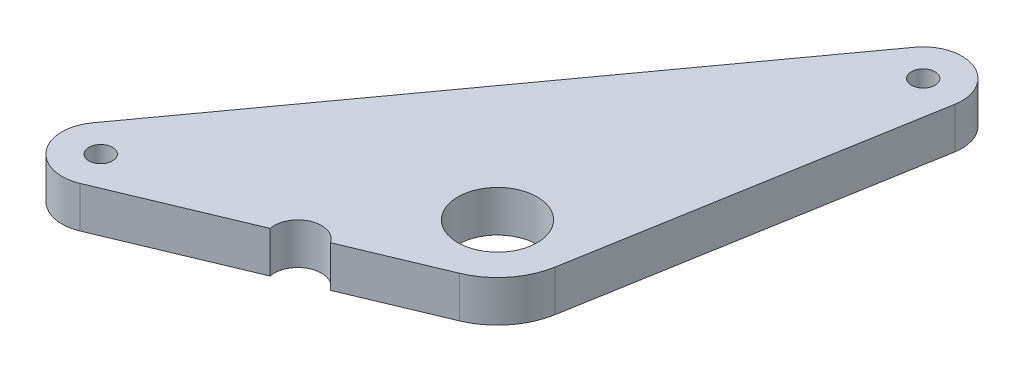
ISO-10303-21;
HEADER;
FILE_DESCRIPTION(('STEP AP214'),'2;1');
FILE_NAME('part.step','',(''),(''),'','','');
FILE_SCHEMA(('AUTOMOTIVE_DESIGN { 1 0 10303 214 1 1 1 1 }'));
ENDSEC;
DATA;
#1=APPLICATION_CONTEXT('core data for automotive mechanical design processes');
#2=APPLICATION_PROTOCOL_DEFINITION('international standard','automotive_design',2000,#1);
#3=PRODUCT_CONTEXT('',#1,'mechanical');
#4=PRODUCT('Part','Part','',(#3));
#5=PRODUCT_RELATED_PRODUCT_CATEGORY('part','',(#4));
#6=PRODUCT_DEFINITION_FORMATION('','',#4);
#7=PRODUCT_DEFINITION_CONTEXT('part definition',#1,'design');
#8=PRODUCT_DEFINITION('design','',#6,#7);
#9=PRODUCT_DEFINITION_SHAPE('','',#8);
#10=(LENGTH_UNIT() NAMED_UNIT(*) SI_UNIT(.MILLI.,.METRE.));
#11=(NAMED_UNIT(*) PLANE_ANGLE_UNIT() SI_UNIT($,.RADIAN.));
#12=(NAMED_UNIT(*) SI_UNIT($,.STERADIAN.) SOLID_ANGLE_UNIT());
#13=UNCERTAINTY_MEASURE_WITH_UNIT(LENGTH_MEASURE(1.E-05),#10,'distance_accuracy_value','');
#14=(GEOMETRIC_REPRESENTATION_CONTEXT(3) GLOBAL_UNCERTAINTY_ASSIGNED_CONTEXT((#13)) GLOBAL_UNIT_ASSIGNED_CONTEXT((#10,
#11,#12)) REPRESENTATION_CONTEXT('',''));
#15=CARTESIAN_POINT('',(0.,0.,0.));
#16=DIRECTION('',(0.,0.,1.));
#17=DIRECTION('',(1.,0.,0.));
#18=AXIS2_PLACEMENT_3D('',#15,#16,#17);
#19=CARTESIAN_POINT('',(368.738835568082,95.885,-12.208730934265));
#20=DIRECTION('',(0.,1.,0.));
#21=DIRECTION('',(0.,0.,1.));
#22=AXIS2_PLACEMENT_3D('',#19,#20,#21);
#23=CYLINDRICAL_SURFACE('',#22,15.24);
#24=CARTESIAN_POINT('',(368.738835568082,104.775,-12.208730934265));
#25=DIRECTION('',(0.,-1.,0.));
#26=DIRECTION('',(0.,0.,-1.));
#27=AXIS2_PLACEMENT_3D('',#24,#25,#26);
#28=CIRCLE('',#27,15.24);
#29=CARTESIAN_POINT('',(383.756046671197,104.775,-9.61239299699919));
#30=VERTEX_POINT('',#29);
#31=CARTESIAN_POINT('',(374.620066838368,104.775,1.85073985041984));
#32=VERTEX_POINT('',#31);
#33=EDGE_CURVE('E71',#30,#32,#28,.T.);
#34=ORIENTED_EDGE('',*,*,#33,.T.);
#35=DIRECTION('',(0.,1.,0.));
#36=VECTOR('',#35,1.);
#37=CARTESIAN_POINT('',(374.620066838368,95.885,1.85073985041984));
#38=LINE('',#37,#36);
#39=CARTESIAN_POINT('',(374.620066838368,95.885,1.85073985041984));
#40=VERTEX_POINT('',#39);
#41=EDGE_CURVE('E117',#40,#32,#38,.T.);
#42=ORIENTED_EDGE('',*,*,#41,.F.);
#43=CARTESIAN_POINT('',(368.738835568082,95.885,-12.208730934265));
#44=DIRECTION('',(0.,-1.,0.));
#45=DIRECTION('',(0.,0.,-1.));
#46=AXIS2_PLACEMENT_3D('',#43,#44,#45);
#47=CIRCLE('',#46,15.24);
#48=CARTESIAN_POINT('',(383.756046671197,95.885,-9.61239299699919));
#49=VERTEX_POINT('',#48);
#50=EDGE_CURVE('E105',#49,#40,#47,.T.);
#51=ORIENTED_EDGE('',*,*,#50,.F.);
#52=DIRECTION('',(0.,1.,0.));
#53=VECTOR('',#52,1.);
#54=CARTESIAN_POINT('',(383.756046671197,95.885,-9.61239299699919));
#55=LINE('',#54,#53);
#56=EDGE_CURVE('E112',#49,#30,#55,.T.);
#57=ORIENTED_EDGE('',*,*,#56,.T.);
#58=EDGE_LOOP('',(#34,#42,#51,#57));
#59=FACE_BOUND('',#58,.T.);
#60=ADVANCED_FACE('F34',(#59),#23,.T.);
#61=CARTESIAN_POINT('',(374.620066838368,95.885,1.85073985041984));
#62=DIRECTION('',(-0.385907563667081,0.,-0.92253745306331));
#63=DIRECTION('',(-0.92253745306331,0.,0.385907563667081));
#64=AXIS2_PLACEMENT_3D('',#61,#62,#63);
#65=PLANE('',#64);
#66=DIRECTION('',(-0.922537453063309,0.,0.385907563667081));
#67=VECTOR('',#66,1.);
#68=CARTESIAN_POINT('',(374.620066838368,104.775,1.85073985041984));
#69=LINE('',#68,#67);
#70=CARTESIAN_POINT('',(355.042542417685,104.775,10.0402336500827));
#71=VERTEX_POINT('',#70);
#72=EDGE_CURVE('E138',#32,#71,#69,.T.);
#73=ORIENTED_EDGE('',*,*,#72,.T.);
#74=DIRECTION('',(0.,1.,0.));
#75=VECTOR('',#74,1.);
#76=CARTESIAN_POINT('',(355.042542417685,95.885,10.0402336500827));
#77=LINE('',#76,#75);
#78=CARTESIAN_POINT('',(355.042542417685,95.885,10.0402336500827));
#79=VERTEX_POINT('',#78);
#80=EDGE_CURVE('E120',#79,#71,#77,.T.);
#81=ORIENTED_EDGE('',*,*,#80,.F.);
#82=DIRECTION('',(-0.922537453063309,0.,0.385907563667081));
#83=VECTOR('',#82,1.);
#84=CARTESIAN_POINT('',(374.620066838368,95.885,1.85073985041984));
#85=LINE('',#84,#83);
#86=EDGE_CURVE('E53',#40,#79,#85,.T.);
#87=ORIENTED_EDGE('',*,*,#86,.F.);
#88=ORIENTED_EDGE('',*,*,#41,.T.);
#89=EDGE_LOOP('',(#73,#81,#87,#88));
#90=FACE_BOUND('',#89,.T.);
#91=ADVANCED_FACE('F160',(#90),#65,.F.);
#92=CARTESIAN_POINT('',(388.21999989401,107.95,-84.4067479512078));
#93=DIRECTION('',(0.,-1.,0.));
#94=DIRECTION('',(0.,0.,-1.));
#95=AXIS2_PLACEMENT_3D('',#92,#93,#94);
#96=CYLINDRICAL_SURFACE('',#95,2.54000000000001);
#97=CARTESIAN_POINT('',(388.21999989401,104.775,-84.4067479512078));
#98=DIRECTION('',(0.,-1.,0.));
#99=DIRECTION('',(0.,0.,-1.));
#100=AXIS2_PLACEMENT_3D('',#97,#98,#99);
#101=CIRCLE('',#100,2.54000000000001);
#102=CARTESIAN_POINT('',(388.21999989401,104.775,-86.9467479512079));
#103=VERTEX_POINT('',#102);
#104=EDGE_CURVE('E194',#103,#103,#101,.F.);
#105=ORIENTED_EDGE('',*,*,#104,.T.);
#106=EDGE_LOOP('',(#105));
#107=FACE_BOUND('',#106,.T.);
#108=CARTESIAN_POINT('',(388.21999989401,95.885,-84.4067479512078));
#109=DIRECTION('',(0.,-1.,0.));
#110=DIRECTION('',(0.,0.,-1.));
#111=AXIS2_PLACEMENT_3D('',#108,#109,#110);
#112=CIRCLE('',#111,2.54000000000001);
#113=CARTESIAN_POINT('',(388.21999989401,95.885,-86.9467479512079));
#114=VERTEX_POINT('',#113);
#115=EDGE_CURVE('E188',#114,#114,#112,.T.);
#116=ORIENTED_EDGE('',*,*,#115,.T.);
#117=EDGE_LOOP('',(#116));
#118=FACE_BOUND('',#117,.T.);
#119=ADVANCED_FACE('F36',(#107,#118),#96,.F.);
#120=CARTESIAN_POINT('',(313.759503148979,107.95,18.2652806586817));
#121=DIRECTION('',(0.,-1.,0.));
#122=DIRECTION('',(0.,0.,-1.));
#123=AXIS2_PLACEMENT_3D('',#120,#121,#122);
#124=CYLINDRICAL_SURFACE('',#123,2.54000000000001);
#125=CARTESIAN_POINT('',(313.759503148979,104.775,18.2652806586817));
#126=DIRECTION('',(0.,-1.,0.));
#127=DIRECTION('',(0.,0.,-1.));
#128=AXIS2_PLACEMENT_3D('',#125,#126,#127);
#129=CIRCLE('',#128,2.54000000000001);
#130=CARTESIAN_POINT('',(313.759503148979,104.775,15.7252806586817));
#131=VERTEX_POINT('',#130);
#132=EDGE_CURVE('E191',#131,#131,#129,.F.);
#133=ORIENTED_EDGE('',*,*,#132,.T.);
#134=EDGE_LOOP('',(#133));
#135=FACE_BOUND('',#134,.T.);
#136=CARTESIAN_POINT('',(313.759503148979,95.885,18.2652806586817));
#137=DIRECTION('',(0.,-1.,0.));
#138=DIRECTION('',(0.,0.,-1.));
#139=AXIS2_PLACEMENT_3D('',#136,#137,#138);
#140=CIRCLE('',#139,2.54000000000001);
#141=CARTESIAN_POINT('',(313.759503148979,95.885,15.7252806586817));
#142=VERTEX_POINT('',#141);
#143=EDGE_CURVE('E135',#142,#142,#140,.T.);
#144=ORIENTED_EDGE('',*,*,#143,.T.);
#145=EDGE_LOOP('',(#144));
#146=FACE_BOUND('',#145,.T.);
#147=ADVANCED_FACE('F212',(#135,#146),#124,.F.);
#148=CARTESIAN_POINT('',(350.8375,95.885,12.8905));
#149=DIRECTION('',(0.,-1.,0.));
#150=DIRECTION('',(0.,0.,-1.));
#151=AXIS2_PLACEMENT_3D('',#148,#149,#150);
#152=PLANE('',#151);
#153=ORIENTED_EDGE('',*,*,#143,.F.);
#154=EDGE_LOOP('',(#153));
#155=FACE_BOUND('',#154,.T.);
#156=CARTESIAN_POINT('',(350.8375,95.885,12.8905));
#157=DIRECTION('',(0.,1.,0.));
#158=DIRECTION('',(0.,0.,-1.));
#159=AXIS2_PLACEMENT_3D('',#156,#157,#158);
#160=CIRCLE('',#159,5.07999999999995);
#161=CARTESIAN_POINT('',(345.855456023667,95.885,13.8832929380733));
#162=VERTEX_POINT('',#161);
#163=EDGE_CURVE('E140',#79,#162,#160,.T.);
#164=ORIENTED_EDGE('',*,*,#163,.T.);
#165=DIRECTION('',(-0.922537453063309,0.,0.385907563667081));
#166=VECTOR('',#165,1.);
#167=CARTESIAN_POINT('',(345.855456023667,95.885,13.8832929380733));
#168=LINE('',#167,#166);
#169=CARTESIAN_POINT('',(316.979331854211,95.885,25.9624932885639));
#170=VERTEX_POINT('',#169);
#171=EDGE_CURVE('E85',#162,#170,#168,.T.);
#172=ORIENTED_EDGE('',*,*,#171,.T.);
#173=CARTESIAN_POINT('',(313.759503148979,95.885,18.2652806586817));
#174=DIRECTION('',(0.,-1.,0.));
#175=DIRECTION('',(0.,0.,-1.));
#176=AXIS2_PLACEMENT_3D('',#173,#174,#175);
#177=CIRCLE('',#176,8.34352318631989);
#178=CARTESIAN_POINT('',(307.005227371757,95.885,13.3668995091696));
#179=VERTEX_POINT('',#178);
#180=EDGE_CURVE('E180',#170,#179,#177,.T.);
#181=ORIENTED_EDGE('',*,*,#180,.T.);
#182=DIRECTION('',(0.587087857266766,0.,-0.809523222551347));
#183=VECTOR('',#182,1.);
#184=CARTESIAN_POINT('',(381.465724116789,95.885,-89.30512910072));
#185=LINE('',#184,#183);
#186=CARTESIAN_POINT('',(381.465724116789,95.885,-89.30512910072));
#187=VERTEX_POINT('',#186);
#188=EDGE_CURVE('E175',#179,#187,#185,.T.);
#189=ORIENTED_EDGE('',*,*,#188,.T.);
#190=CARTESIAN_POINT('',(388.21999989401,95.885,-84.4067479512078));
#191=DIRECTION('',(0.,-1.,0.));
#192=DIRECTION('',(0.,0.,-1.));
#193=AXIS2_PLACEMENT_3D('',#190,#191,#192);
#194=CIRCLE('',#193,8.34352318631987);
#195=CARTESIAN_POINT('',(396.441551667809,95.885,-82.9853171258076));
#196=VERTEX_POINT('',#195);
#197=EDGE_CURVE('E107',#187,#196,#194,.T.);
#198=ORIENTED_EDGE('',*,*,#197,.T.);
#199=DIRECTION('',(-0.170363381710353,0.,0.985381305978661));
#200=VECTOR('',#199,1.);
#201=CARTESIAN_POINT('',(396.441551667809,95.885,-82.9853171258076));
#202=LINE('',#201,#200);
#203=EDGE_CURVE('E100',#196,#49,#202,.T.);
#204=ORIENTED_EDGE('',*,*,#203,.T.);
#205=ORIENTED_EDGE('',*,*,#50,.T.);
#206=ORIENTED_EDGE('',*,*,#86,.T.);
#207=EDGE_LOOP('',(#164,#172,#181,#189,#198,#204,#205,#206));
#208=FACE_BOUND('',#207,.T.);
#209=ORIENTED_EDGE('',*,*,#115,.F.);
#210=EDGE_LOOP('',(#209));
#211=FACE_BOUND('',#210,.T.);
#212=CARTESIAN_POINT('',(368.738835568082,95.885,-12.208730934265));
#213=DIRECTION('',(0.,-1.,0.));
#214=DIRECTION('',(0.,0.,-1.));
#215=AXIS2_PLACEMENT_3D('',#212,#213,#214);
#216=CIRCLE('',#215,8.54600018000003);
#217=CARTESIAN_POINT('',(368.738835568082,95.885,-20.754731114265));
#218=VERTEX_POINT('',#217);
#219=EDGE_CURVE('E198',#218,#218,#216,.T.);
#220=ORIENTED_EDGE('',*,*,#219,.F.);
#221=EDGE_LOOP('',(#220));
#222=FACE_BOUND('',#221,.T.);
#223=ADVANCED_FACE('F102',(#155,#208,#211,#222),#152,.T.);
#224=CARTESIAN_POINT('',(350.8375,95.885,12.8905));
#225=DIRECTION('',(0.,1.,0.));
#226=DIRECTION('',(0.,0.,1.));
#227=AXIS2_PLACEMENT_3D('',#224,#225,#226);
#228=CYLINDRICAL_SURFACE('',#227,5.07999999999995);
#229=ORIENTED_EDGE('',*,*,#80,.T.);
#230=CARTESIAN_POINT('',(350.8375,104.775,12.8905));
#231=DIRECTION('',(0.,1.,0.));
#232=DIRECTION('',(0.,0.,-1.));
#233=AXIS2_PLACEMENT_3D('',#230,#231,#232);
#234=CIRCLE('',#233,5.07999999999995);
#235=CARTESIAN_POINT('',(345.855456023667,104.775,13.8832929380733));
#236=VERTEX_POINT('',#235);
#237=EDGE_CURVE('E11',#71,#236,#234,.T.);
#238=ORIENTED_EDGE('',*,*,#237,.T.);
#239=DIRECTION('',(0.,1.,0.));
#240=VECTOR('',#239,1.);
#241=CARTESIAN_POINT('',(345.855456023667,95.885,13.8832929380733));
#242=LINE('',#241,#240);
#243=EDGE_CURVE('E38',#162,#236,#242,.T.);
#244=ORIENTED_EDGE('',*,*,#243,.F.);
#245=ORIENTED_EDGE('',*,*,#163,.F.);
#246=EDGE_LOOP('',(#229,#238,#244,#245));
#247=FACE_BOUND('',#246,.T.);
#248=ADVANCED_FACE('F158',(#247),#228,.F.);
#249=CARTESIAN_POINT('',(345.855456023667,95.885,13.8832929380733));
#250=DIRECTION('',(-0.385907563667081,0.,-0.92253745306331));
#251=DIRECTION('',(-0.92253745306331,0.,0.385907563667081));
#252=AXIS2_PLACEMENT_3D('',#249,#250,#251);
#253=PLANE('',#252);
#254=ORIENTED_EDGE('',*,*,#243,.T.);
#255=DIRECTION('',(-0.922537453063309,0.,0.385907563667081));
#256=VECTOR('',#255,1.);
#257=CARTESIAN_POINT('',(345.855456023667,104.775,13.8832929380733));
#258=LINE('',#257,#256);
#259=CARTESIAN_POINT('',(316.979331854211,104.775,25.9624932885639));
#260=VERTEX_POINT('',#259);
#261=EDGE_CURVE('E124',#236,#260,#258,.T.);
#262=ORIENTED_EDGE('',*,*,#261,.T.);
#263=DIRECTION('',(0.,1.,0.));
#264=VECTOR('',#263,1.);
#265=CARTESIAN_POINT('',(316.979331854211,95.885,25.9624932885639));
#266=LINE('',#265,#264);
#267=EDGE_CURVE('E150',#170,#260,#266,.T.);
#268=ORIENTED_EDGE('',*,*,#267,.F.);
#269=ORIENTED_EDGE('',*,*,#171,.F.);
#270=EDGE_LOOP('',(#254,#262,#268,#269));
#271=FACE_BOUND('',#270,.T.);
#272=ADVANCED_FACE('F155',(#271),#253,.F.);
#273=CARTESIAN_POINT('',(313.759503148979,95.885,18.2652806586817));
#274=DIRECTION('',(0.,1.,0.));
#275=DIRECTION('',(0.,0.,1.));
#276=AXIS2_PLACEMENT_3D('',#273,#274,#275);
#277=CYLINDRICAL_SURFACE('',#276,8.34352318631989);
#278=ORIENTED_EDGE('',*,*,#267,.T.);
#279=CARTESIAN_POINT('',(313.759503148979,104.775,18.2652806586817));
#280=DIRECTION('',(0.,-1.,0.));
#281=DIRECTION('',(0.,0.,-1.));
#282=AXIS2_PLACEMENT_3D('',#279,#280,#281);
#283=CIRCLE('',#282,8.34352318631989);
#284=CARTESIAN_POINT('',(307.005227371757,104.775,13.3668995091696));
#285=VERTEX_POINT('',#284);
#286=EDGE_CURVE('E127',#260,#285,#283,.T.);
#287=ORIENTED_EDGE('',*,*,#286,.T.);
#288=DIRECTION('',(0.,1.,0.));
#289=VECTOR('',#288,1.);
#290=CARTESIAN_POINT('',(307.005227371757,95.885,13.3668995091696));
#291=LINE('',#290,#289);
#292=EDGE_CURVE('E148',#179,#285,#291,.T.);
#293=ORIENTED_EDGE('',*,*,#292,.F.);
#294=ORIENTED_EDGE('',*,*,#180,.F.);
#295=EDGE_LOOP('',(#278,#287,#293,#294));
#296=FACE_BOUND('',#295,.T.);
#297=ADVANCED_FACE('F179',(#296),#277,.T.);
#298=CARTESIAN_POINT('',(381.465724116789,95.885,-89.30512910072));
#299=DIRECTION('',(0.809523222551347,0.,0.587087857266765));
#300=DIRECTION('',(0.587087857266766,0.,-0.809523222551347));
#301=AXIS2_PLACEMENT_3D('',#298,#299,#300);
#302=PLANE('',#301);
#303=ORIENTED_EDGE('',*,*,#292,.T.);
#304=DIRECTION('',(0.587087857266766,0.,-0.809523222551347));
#305=VECTOR('',#304,1.);
#306=CARTESIAN_POINT('',(381.465724116789,104.775,-89.30512910072));
#307=LINE('',#306,#305);
#308=CARTESIAN_POINT('',(381.465724116789,104.775,-89.30512910072));
#309=VERTEX_POINT('',#308);
#310=EDGE_CURVE('E44',#285,#309,#307,.T.);
#311=ORIENTED_EDGE('',*,*,#310,.T.);
#312=DIRECTION('',(0.,1.,0.));
#313=VECTOR('',#312,1.);
#314=CARTESIAN_POINT('',(381.465724116789,95.885,-89.30512910072));
#315=LINE('',#314,#313);
#316=EDGE_CURVE('E145',#187,#309,#315,.T.);
#317=ORIENTED_EDGE('',*,*,#316,.F.);
#318=ORIENTED_EDGE('',*,*,#188,.F.);
#319=EDGE_LOOP('',(#303,#311,#317,#318));
#320=FACE_BOUND('',#319,.T.);
#321=ADVANCED_FACE('F174',(#320),#302,.F.);
#322=CARTESIAN_POINT('',(388.21999989401,95.885,-84.4067479512078));
#323=DIRECTION('',(0.,1.,0.));
#324=DIRECTION('',(0.,0.,1.));
#325=AXIS2_PLACEMENT_3D('',#322,#323,#324);
#326=CYLINDRICAL_SURFACE('',#325,8.34352318631987);
#327=CARTESIAN_POINT('',(388.21999989401,104.775,-84.4067479512078));
#328=DIRECTION('',(0.,-1.,0.));
#329=DIRECTION('',(0.,0.,-1.));
#330=AXIS2_PLACEMENT_3D('',#327,#328,#329);
#331=CIRCLE('',#330,8.34352318631987);
#332=CARTESIAN_POINT('',(396.441551667809,104.775,-82.9853171258076));
#333=VERTEX_POINT('',#332);
#334=EDGE_CURVE('E132',#309,#333,#331,.T.);
#335=ORIENTED_EDGE('',*,*,#334,.T.);
#336=DIRECTION('',(0.,1.,0.));
#337=VECTOR('',#336,1.);
#338=CARTESIAN_POINT('',(396.441551667809,95.885,-82.9853171258076));
#339=LINE('',#338,#337);
#340=EDGE_CURVE('E116',#196,#333,#339,.T.);
#341=ORIENTED_EDGE('',*,*,#340,.F.);
#342=ORIENTED_EDGE('',*,*,#197,.F.);
#343=ORIENTED_EDGE('',*,*,#316,.T.);
#344=EDGE_LOOP('',(#335,#341,#342,#343));
#345=FACE_BOUND('',#344,.T.);
#346=ADVANCED_FACE('F170',(#345),#326,.T.);
#347=CARTESIAN_POINT('',(396.441551667809,95.885,-82.9853171258076));
#348=DIRECTION('',(-0.985381305978661,0.,-0.170363381710353));
#349=DIRECTION('',(-0.170363381710353,0.,0.985381305978662));
#350=AXIS2_PLACEMENT_3D('',#347,#348,#349);
#351=PLANE('',#350);
#352=DIRECTION('',(-0.170363381710353,0.,0.985381305978661));
#353=VECTOR('',#352,1.);
#354=CARTESIAN_POINT('',(396.441551667809,104.775,-82.9853171258076));
#355=LINE('',#354,#353);
#356=EDGE_CURVE('E115',#333,#30,#355,.T.);
#357=ORIENTED_EDGE('',*,*,#356,.T.);
#358=ORIENTED_EDGE('',*,*,#56,.F.);
#359=ORIENTED_EDGE('',*,*,#203,.F.);
#360=ORIENTED_EDGE('',*,*,#340,.T.);
#361=EDGE_LOOP('',(#357,#358,#359,#360));
#362=FACE_BOUND('',#361,.T.);
#363=ADVANCED_FACE('F113',(#362),#351,.F.);
#364=CARTESIAN_POINT('',(350.8375,104.775,12.8905));
#365=DIRECTION('',(0.,-1.,0.));
#366=DIRECTION('',(0.,0.,-1.));
#367=AXIS2_PLACEMENT_3D('',#364,#365,#366);
#368=PLANE('',#367);
#369=ORIENTED_EDGE('',*,*,#33,.F.);
#370=ORIENTED_EDGE('',*,*,#356,.F.);
#371=ORIENTED_EDGE('',*,*,#334,.F.);
#372=ORIENTED_EDGE('',*,*,#310,.F.);
#373=ORIENTED_EDGE('',*,*,#286,.F.);
#374=ORIENTED_EDGE('',*,*,#261,.F.);
#375=ORIENTED_EDGE('',*,*,#237,.F.);
#376=ORIENTED_EDGE('',*,*,#72,.F.);
#377=EDGE_LOOP('',(#369,#370,#371,#372,#373,#374,#375,#376));
#378=FACE_BOUND('',#377,.T.);
#379=ORIENTED_EDGE('',*,*,#104,.F.);
#380=EDGE_LOOP('',(#379));
#381=FACE_BOUND('',#380,.T.);
#382=ORIENTED_EDGE('',*,*,#132,.F.);
#383=EDGE_LOOP('',(#382));
#384=FACE_BOUND('',#383,.T.);
#385=CARTESIAN_POINT('',(368.738835568082,104.775,-12.208730934265));
#386=DIRECTION('',(0.,-1.,0.));
#387=DIRECTION('',(0.,0.,-1.));
#388=AXIS2_PLACEMENT_3D('',#385,#386,#387);
#389=CIRCLE('',#388,8.54600018000003);
#390=CARTESIAN_POINT('',(368.738835568082,104.775,-20.754731114265));
#391=VERTEX_POINT('',#390);
#392=EDGE_CURVE('E197',#391,#391,#389,.T.);
#393=ORIENTED_EDGE('',*,*,#392,.T.);
#394=EDGE_LOOP('',(#393));
#395=FACE_BOUND('',#394,.T.);
#396=ADVANCED_FACE('F161',(#378,#381,#384,#395),#368,.F.);
#397=CARTESIAN_POINT('',(368.738835568082,104.775,-12.208730934265));
#398=DIRECTION('',(0.,-1.,0.));
#399=DIRECTION('',(0.,0.,-1.));
#400=AXIS2_PLACEMENT_3D('',#397,#398,#399);
#401=CYLINDRICAL_SURFACE('',#400,8.54600018000003);
#402=ORIENTED_EDGE('',*,*,#392,.F.);
#403=EDGE_LOOP('',(#402));
#404=FACE_BOUND('',#403,.T.);
#405=ORIENTED_EDGE('',*,*,#219,.T.);
#406=EDGE_LOOP('',(#405));
#407=FACE_BOUND('',#406,.T.);
#408=ADVANCED_FACE('F205',(#404,#407),#401,.F.);
#409=CLOSED_SHELL('',(#60,#91,#119,#147,#223,#248,#272,#297,#321,#346,#363,#396,#408));
#410=MANIFOLD_SOLID_BREP('B2',#409);
#411=ADVANCED_BREP_SHAPE_REPRESENTATION('',(#18,#410),#14);
#412=SHAPE_DEFINITION_REPRESENTATION(#9,#411);
ENDSEC;
END-ISO-10303-21;
